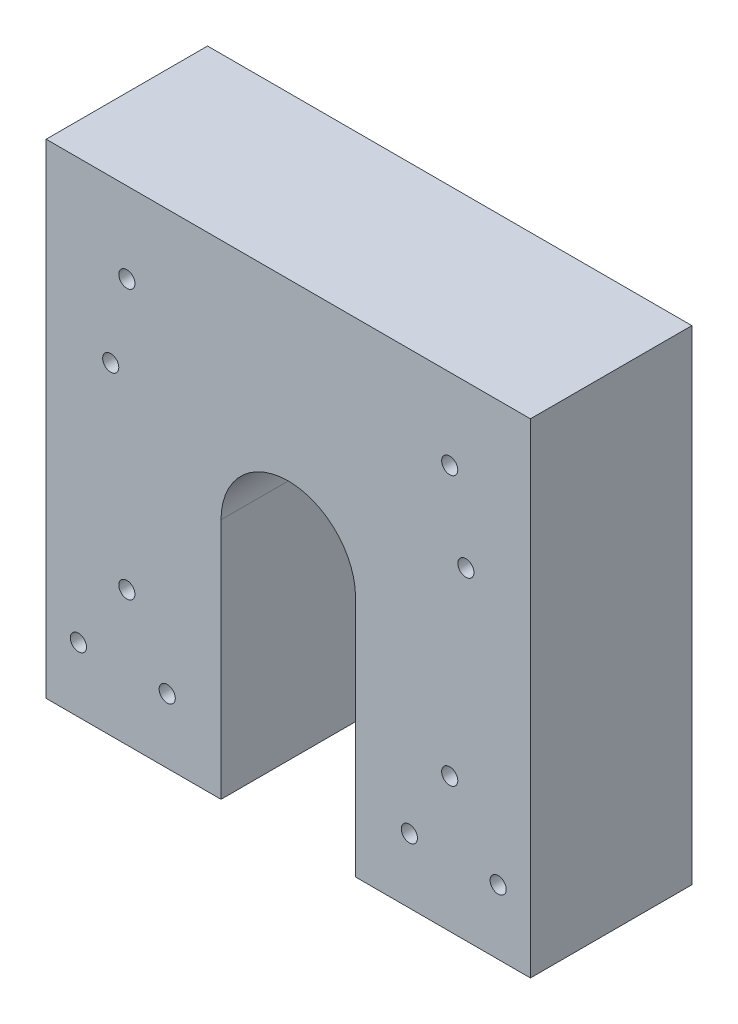
ISO-10303-21;
HEADER;
FILE_DESCRIPTION(('STEP AP214'),'2;1');
FILE_NAME('part.step','',(''),(''),'','','');
FILE_SCHEMA(('AUTOMOTIVE_DESIGN { 1 0 10303 214 1 1 1 1 }'));
ENDSEC;
DATA;
#1=APPLICATION_CONTEXT('core data for automotive mechanical design processes');
#2=APPLICATION_PROTOCOL_DEFINITION('international standard','automotive_design',2000,#1);
#3=PRODUCT_CONTEXT('',#1,'mechanical');
#4=PRODUCT('Part','Part','',(#3));
#5=PRODUCT_RELATED_PRODUCT_CATEGORY('part','',(#4));
#6=PRODUCT_DEFINITION_FORMATION('','',#4);
#7=PRODUCT_DEFINITION_CONTEXT('part definition',#1,'design');
#8=PRODUCT_DEFINITION('design','',#6,#7);
#9=PRODUCT_DEFINITION_SHAPE('','',#8);
#10=(LENGTH_UNIT() NAMED_UNIT(*) SI_UNIT(.MILLI.,.METRE.));
#11=(NAMED_UNIT(*) PLANE_ANGLE_UNIT() SI_UNIT($,.RADIAN.));
#12=(NAMED_UNIT(*) SI_UNIT($,.STERADIAN.) SOLID_ANGLE_UNIT());
#13=UNCERTAINTY_MEASURE_WITH_UNIT(LENGTH_MEASURE(1.E-05),#10,'distance_accuracy_value','');
#14=(GEOMETRIC_REPRESENTATION_CONTEXT(3) GLOBAL_UNCERTAINTY_ASSIGNED_CONTEXT((#13)) GLOBAL_UNIT_ASSIGNED_CONTEXT((#10,
#11,#12)) REPRESENTATION_CONTEXT('',''));
#15=CARTESIAN_POINT('',(0.,0.,0.));
#16=DIRECTION('',(0.,0.,1.));
#17=DIRECTION('',(1.,0.,0.));
#18=AXIS2_PLACEMENT_3D('',#15,#16,#17);
#19=CARTESIAN_POINT('',(0.,0.,30.));
#20=DIRECTION('',(0.,0.,-1.));
#21=DIRECTION('',(-1.,0.,0.));
#22=AXIS2_PLACEMENT_3D('',#19,#20,#21);
#23=PLANE('',#22);
#24=CARTESIAN_POINT('',(-30.,-20.,30.));
#25=DIRECTION('',(0.,0.,1.));
#26=DIRECTION('',(1.,0.,0.));
#27=AXIS2_PLACEMENT_3D('',#24,#25,#26);
#28=CIRCLE('',#27,1.5);
#29=CARTESIAN_POINT('',(-28.5,-20.,30.));
#30=VERTEX_POINT('',#29);
#31=EDGE_CURVE('E252',#30,#30,#28,.T.);
#32=ORIENTED_EDGE('',*,*,#31,.F.);
#33=EDGE_LOOP('',(#32));
#34=FACE_BOUND('',#33,.T.);
#35=CARTESIAN_POINT('',(30.,-20.,30.));
#36=DIRECTION('',(0.,0.,1.));
#37=DIRECTION('',(1.,0.,0.));
#38=AXIS2_PLACEMENT_3D('',#35,#36,#37);
#39=CIRCLE('',#38,1.5);
#40=CARTESIAN_POINT('',(31.5,-20.,30.));
#41=VERTEX_POINT('',#40);
#42=EDGE_CURVE('E410',#41,#41,#39,.T.);
#43=ORIENTED_EDGE('',*,*,#42,.F.);
#44=EDGE_LOOP('',(#43));
#45=FACE_BOUND('',#44,.T.);
#46=CARTESIAN_POINT('',(-33.,15.,30.));
#47=DIRECTION('',(0.,0.,1.));
#48=DIRECTION('',(1.,0.,0.));
#49=AXIS2_PLACEMENT_3D('',#46,#47,#48);
#50=CIRCLE('',#49,1.5);
#51=CARTESIAN_POINT('',(-31.5,15.,30.));
#52=VERTEX_POINT('',#51);
#53=EDGE_CURVE('E395',#52,#52,#50,.T.);
#54=ORIENTED_EDGE('',*,*,#53,.F.);
#55=EDGE_LOOP('',(#54));
#56=FACE_BOUND('',#55,.T.);
#57=CARTESIAN_POINT('',(-22.5,-33.,30.));
#58=DIRECTION('',(0.,0.,1.));
#59=DIRECTION('',(1.,0.,0.));
#60=AXIS2_PLACEMENT_3D('',#57,#58,#59);
#61=CIRCLE('',#60,1.5);
#62=CARTESIAN_POINT('',(-21.,-33.,30.));
#63=VERTEX_POINT('',#62);
#64=EDGE_CURVE('E376',#63,#63,#61,.T.);
#65=ORIENTED_EDGE('',*,*,#64,.F.);
#66=EDGE_LOOP('',(#65));
#67=FACE_BOUND('',#66,.T.);
#68=CARTESIAN_POINT('',(-39.,-33.,30.));
#69=DIRECTION('',(0.,0.,1.));
#70=DIRECTION('',(1.,0.,0.));
#71=AXIS2_PLACEMENT_3D('',#68,#69,#70);
#72=CIRCLE('',#71,1.5);
#73=CARTESIAN_POINT('',(-37.5,-33.,30.));
#74=VERTEX_POINT('',#73);
#75=EDGE_CURVE('E373',#74,#74,#72,.T.);
#76=ORIENTED_EDGE('',*,*,#75,.F.);
#77=EDGE_LOOP('',(#76));
#78=FACE_BOUND('',#77,.T.);
#79=CARTESIAN_POINT('',(-30.,30.,30.));
#80=DIRECTION('',(0.,0.,1.));
#81=DIRECTION('',(1.,0.,0.));
#82=AXIS2_PLACEMENT_3D('',#79,#80,#81);
#83=CIRCLE('',#82,1.5);
#84=CARTESIAN_POINT('',(-28.5,30.,30.));
#85=VERTEX_POINT('',#84);
#86=EDGE_CURVE('E218',#85,#85,#83,.T.);
#87=ORIENTED_EDGE('',*,*,#86,.F.);
#88=EDGE_LOOP('',(#87));
#89=FACE_BOUND('',#88,.T.);
#90=DIRECTION('',(0.,-1.,0.));
#91=VECTOR('',#90,1.);
#92=CARTESIAN_POINT('',(12.5,0.,30.));
#93=LINE('',#92,#91);
#94=CARTESIAN_POINT('',(12.5,0.,30.));
#95=VERTEX_POINT('',#94);
#96=CARTESIAN_POINT('',(12.5,-45.,30.));
#97=VERTEX_POINT('',#96);
#98=EDGE_CURVE('E132',#95,#97,#93,.T.);
#99=ORIENTED_EDGE('',*,*,#98,.T.);
#100=DIRECTION('',(1.,0.,0.));
#101=VECTOR('',#100,1.);
#102=CARTESIAN_POINT('',(-45.,-45.,30.));
#103=LINE('',#102,#101);
#104=CARTESIAN_POINT('',(45.,-45.,30.));
#105=VERTEX_POINT('',#104);
#106=EDGE_CURVE('E70',#97,#105,#103,.T.);
#107=ORIENTED_EDGE('',*,*,#106,.T.);
#108=DIRECTION('',(0.,1.,0.));
#109=VECTOR('',#108,1.);
#110=CARTESIAN_POINT('',(45.,-45.,30.));
#111=LINE('',#110,#109);
#112=CARTESIAN_POINT('',(45.,45.,30.));
#113=VERTEX_POINT('',#112);
#114=EDGE_CURVE('E171',#105,#113,#111,.T.);
#115=ORIENTED_EDGE('',*,*,#114,.T.);
#116=DIRECTION('',(-1.,0.,0.));
#117=VECTOR('',#116,1.);
#118=CARTESIAN_POINT('',(-45.,45.,30.));
#119=LINE('',#118,#117);
#120=CARTESIAN_POINT('',(-45.,45.,30.));
#121=VERTEX_POINT('',#120);
#122=EDGE_CURVE('E100',#113,#121,#119,.T.);
#123=ORIENTED_EDGE('',*,*,#122,.T.);
#124=DIRECTION('',(0.,-1.,0.));
#125=VECTOR('',#124,1.);
#126=CARTESIAN_POINT('',(-45.,-45.,30.));
#127=LINE('',#126,#125);
#128=CARTESIAN_POINT('',(-45.,-45.,30.));
#129=VERTEX_POINT('',#128);
#130=EDGE_CURVE('E177',#121,#129,#127,.T.);
#131=ORIENTED_EDGE('',*,*,#130,.T.);
#132=CARTESIAN_POINT('',(-12.5,-45.,30.));
#133=VERTEX_POINT('',#132);
#134=EDGE_CURVE('E180',#129,#133,#103,.T.);
#135=ORIENTED_EDGE('',*,*,#134,.T.);
#136=DIRECTION('',(0.,-1.,0.));
#137=VECTOR('',#136,1.);
#138=CARTESIAN_POINT('',(-12.5,0.,30.));
#139=LINE('',#138,#137);
#140=CARTESIAN_POINT('',(-12.5,0.,30.));
#141=VERTEX_POINT('',#140);
#142=EDGE_CURVE('E130',#141,#133,#139,.T.);
#143=ORIENTED_EDGE('',*,*,#142,.F.);
#144=CARTESIAN_POINT('',(0.,0.,30.));
#145=DIRECTION('',(0.,0.,1.));
#146=DIRECTION('',(1.,0.,0.));
#147=AXIS2_PLACEMENT_3D('',#144,#145,#146);
#148=CIRCLE('',#147,12.5);
#149=EDGE_CURVE('E124',#95,#141,#148,.T.);
#150=ORIENTED_EDGE('',*,*,#149,.F.);
#151=EDGE_LOOP('',(#99,#107,#115,#123,#131,#135,#143,#150));
#152=FACE_BOUND('',#151,.T.);
#153=CARTESIAN_POINT('',(22.5,-33.,30.));
#154=DIRECTION('',(0.,0.,1.));
#155=DIRECTION('',(1.,0.,0.));
#156=AXIS2_PLACEMENT_3D('',#153,#154,#155);
#157=CIRCLE('',#156,1.5);
#158=CARTESIAN_POINT('',(24.,-33.,30.));
#159=VERTEX_POINT('',#158);
#160=EDGE_CURVE('E382',#159,#159,#157,.F.);
#161=ORIENTED_EDGE('',*,*,#160,.T.);
#162=EDGE_LOOP('',(#161));
#163=FACE_BOUND('',#162,.T.);
#164=CARTESIAN_POINT('',(30.,30.,30.));
#165=DIRECTION('',(0.,0.,1.));
#166=DIRECTION('',(1.,0.,0.));
#167=AXIS2_PLACEMENT_3D('',#164,#165,#166);
#168=CIRCLE('',#167,1.5);
#169=CARTESIAN_POINT('',(31.5,30.,30.));
#170=VERTEX_POINT('',#169);
#171=EDGE_CURVE('E390',#170,#170,#168,.F.);
#172=ORIENTED_EDGE('',*,*,#171,.T.);
#173=EDGE_LOOP('',(#172));
#174=FACE_BOUND('',#173,.T.);
#175=CARTESIAN_POINT('',(33.,15.,30.));
#176=DIRECTION('',(0.,0.,1.));
#177=DIRECTION('',(1.,0.,0.));
#178=AXIS2_PLACEMENT_3D('',#175,#176,#177);
#179=CIRCLE('',#178,1.5);
#180=CARTESIAN_POINT('',(34.5,15.,30.));
#181=VERTEX_POINT('',#180);
#182=EDGE_CURVE('E386',#181,#181,#179,.F.);
#183=ORIENTED_EDGE('',*,*,#182,.T.);
#184=EDGE_LOOP('',(#183));
#185=FACE_BOUND('',#184,.T.);
#186=CARTESIAN_POINT('',(39.,-33.,30.));
#187=DIRECTION('',(0.,0.,1.));
#188=DIRECTION('',(1.,0.,0.));
#189=AXIS2_PLACEMENT_3D('',#186,#187,#188);
#190=CIRCLE('',#189,1.5);
#191=CARTESIAN_POINT('',(40.5,-33.,30.));
#192=VERTEX_POINT('',#191);
#193=EDGE_CURVE('E391',#192,#192,#190,.F.);
#194=ORIENTED_EDGE('',*,*,#193,.T.);
#195=EDGE_LOOP('',(#194));
#196=FACE_BOUND('',#195,.T.);
#197=ADVANCED_FACE('F38',(#34,#45,#56,#67,#78,#89,#152,#163,#174,#185,#196),#23,.F.);
#198=CARTESIAN_POINT('',(0.,0.,0.));
#199=DIRECTION('',(0.,0.,-1.));
#200=DIRECTION('',(-1.,0.,0.));
#201=AXIS2_PLACEMENT_3D('',#198,#199,#200);
#202=PLANE('',#201);
#203=CARTESIAN_POINT('',(33.,15.,0.));
#204=DIRECTION('',(0.,0.,-1.));
#205=DIRECTION('',(-1.,0.,0.));
#206=AXIS2_PLACEMENT_3D('',#203,#204,#205);
#207=CIRCLE('',#206,1.5);
#208=CARTESIAN_POINT('',(31.5,15.,0.));
#209=VERTEX_POINT('',#208);
#210=EDGE_CURVE('E238',#209,#209,#207,.F.);
#211=ORIENTED_EDGE('',*,*,#210,.T.);
#212=EDGE_LOOP('',(#211));
#213=FACE_BOUND('',#212,.T.);
#214=CARTESIAN_POINT('',(22.5,-33.,0.));
#215=DIRECTION('',(0.,0.,-1.));
#216=DIRECTION('',(-1.,0.,0.));
#217=AXIS2_PLACEMENT_3D('',#214,#215,#216);
#218=CIRCLE('',#217,1.5);
#219=CARTESIAN_POINT('',(21.,-33.,0.));
#220=VERTEX_POINT('',#219);
#221=EDGE_CURVE('E226',#220,#220,#218,.F.);
#222=ORIENTED_EDGE('',*,*,#221,.T.);
#223=EDGE_LOOP('',(#222));
#224=FACE_BOUND('',#223,.T.);
#225=CARTESIAN_POINT('',(-22.5,-33.,0.));
#226=DIRECTION('',(0.,0.,-1.));
#227=DIRECTION('',(-1.,0.,0.));
#228=AXIS2_PLACEMENT_3D('',#225,#226,#227);
#229=CIRCLE('',#228,1.5);
#230=CARTESIAN_POINT('',(-24.,-33.,0.));
#231=VERTEX_POINT('',#230);
#232=EDGE_CURVE('E222',#231,#231,#229,.T.);
#233=ORIENTED_EDGE('',*,*,#232,.F.);
#234=EDGE_LOOP('',(#233));
#235=FACE_BOUND('',#234,.T.);
#236=CARTESIAN_POINT('',(-39.,-33.,0.));
#237=DIRECTION('',(0.,0.,-1.));
#238=DIRECTION('',(-1.,0.,0.));
#239=AXIS2_PLACEMENT_3D('',#236,#237,#238);
#240=CIRCLE('',#239,1.5);
#241=CARTESIAN_POINT('',(-40.5,-33.,0.));
#242=VERTEX_POINT('',#241);
#243=EDGE_CURVE('E217',#242,#242,#240,.T.);
#244=ORIENTED_EDGE('',*,*,#243,.F.);
#245=EDGE_LOOP('',(#244));
#246=FACE_BOUND('',#245,.T.);
#247=CARTESIAN_POINT('',(-30.,30.,0.));
#248=DIRECTION('',(0.,0.,-1.));
#249=DIRECTION('',(-1.,0.,0.));
#250=AXIS2_PLACEMENT_3D('',#247,#248,#249);
#251=CIRCLE('',#250,1.5);
#252=CARTESIAN_POINT('',(-31.5,30.,0.));
#253=VERTEX_POINT('',#252);
#254=EDGE_CURVE('E213',#253,#253,#251,.T.);
#255=ORIENTED_EDGE('',*,*,#254,.F.);
#256=EDGE_LOOP('',(#255));
#257=FACE_BOUND('',#256,.T.);
#258=DIRECTION('',(1.,0.,0.));
#259=VECTOR('',#258,1.);
#260=CARTESIAN_POINT('',(-45.,-45.,0.));
#261=LINE('',#260,#259);
#262=CARTESIAN_POINT('',(12.5,-45.,0.));
#263=VERTEX_POINT('',#262);
#264=CARTESIAN_POINT('',(45.,-45.,0.));
#265=VERTEX_POINT('',#264);
#266=EDGE_CURVE('E92',#263,#265,#261,.T.);
#267=ORIENTED_EDGE('',*,*,#266,.F.);
#268=DIRECTION('',(0.,1.,0.));
#269=VECTOR('',#268,1.);
#270=CARTESIAN_POINT('',(12.5,0.,0.));
#271=LINE('',#270,#269);
#272=CARTESIAN_POINT('',(12.5,0.,0.));
#273=VERTEX_POINT('',#272);
#274=EDGE_CURVE('E11',#263,#273,#271,.T.);
#275=ORIENTED_EDGE('',*,*,#274,.T.);
#276=CARTESIAN_POINT('',(0.,0.,0.));
#277=DIRECTION('',(0.,0.,-1.));
#278=DIRECTION('',(-1.,0.,0.));
#279=AXIS2_PLACEMENT_3D('',#276,#277,#278);
#280=CIRCLE('',#279,12.5);
#281=CARTESIAN_POINT('',(-12.5,0.,0.));
#282=VERTEX_POINT('',#281);
#283=EDGE_CURVE('E127',#282,#273,#280,.T.);
#284=ORIENTED_EDGE('',*,*,#283,.F.);
#285=DIRECTION('',(0.,1.,0.));
#286=VECTOR('',#285,1.);
#287=CARTESIAN_POINT('',(-12.5,0.,0.));
#288=LINE('',#287,#286);
#289=CARTESIAN_POINT('',(-12.5,-45.,0.));
#290=VERTEX_POINT('',#289);
#291=EDGE_CURVE('E53',#290,#282,#288,.T.);
#292=ORIENTED_EDGE('',*,*,#291,.F.);
#293=CARTESIAN_POINT('',(-45.,-45.,0.));
#294=VERTEX_POINT('',#293);
#295=EDGE_CURVE('E174',#294,#290,#261,.T.);
#296=ORIENTED_EDGE('',*,*,#295,.F.);
#297=DIRECTION('',(0.,-1.,0.));
#298=VECTOR('',#297,1.);
#299=CARTESIAN_POINT('',(-45.,-45.,0.));
#300=LINE('',#299,#298);
#301=CARTESIAN_POINT('',(-45.,45.,0.));
#302=VERTEX_POINT('',#301);
#303=EDGE_CURVE('E190',#302,#294,#300,.T.);
#304=ORIENTED_EDGE('',*,*,#303,.F.);
#305=DIRECTION('',(-1.,0.,0.));
#306=VECTOR('',#305,1.);
#307=CARTESIAN_POINT('',(-45.,45.,0.));
#308=LINE('',#307,#306);
#309=CARTESIAN_POINT('',(45.,45.,0.));
#310=VERTEX_POINT('',#309);
#311=EDGE_CURVE('E187',#310,#302,#308,.T.);
#312=ORIENTED_EDGE('',*,*,#311,.F.);
#313=DIRECTION('',(0.,1.,0.));
#314=VECTOR('',#313,1.);
#315=CARTESIAN_POINT('',(45.,-45.,0.));
#316=LINE('',#315,#314);
#317=EDGE_CURVE('E159',#265,#310,#316,.T.);
#318=ORIENTED_EDGE('',*,*,#317,.F.);
#319=EDGE_LOOP('',(#267,#275,#284,#292,#296,#304,#312,#318));
#320=FACE_BOUND('',#319,.T.);
#321=CARTESIAN_POINT('',(-33.,15.,0.));
#322=DIRECTION('',(0.,0.,-1.));
#323=DIRECTION('',(-1.,0.,0.));
#324=AXIS2_PLACEMENT_3D('',#321,#322,#323);
#325=CIRCLE('',#324,1.5);
#326=CARTESIAN_POINT('',(-34.5,15.,0.));
#327=VERTEX_POINT('',#326);
#328=EDGE_CURVE('E230',#327,#327,#325,.T.);
#329=ORIENTED_EDGE('',*,*,#328,.F.);
#330=EDGE_LOOP('',(#329));
#331=FACE_BOUND('',#330,.T.);
#332=CARTESIAN_POINT('',(30.,30.,0.));
#333=DIRECTION('',(0.,0.,-1.));
#334=DIRECTION('',(-1.,0.,0.));
#335=AXIS2_PLACEMENT_3D('',#332,#333,#334);
#336=CIRCLE('',#335,1.5);
#337=CARTESIAN_POINT('',(28.5,30.,0.));
#338=VERTEX_POINT('',#337);
#339=EDGE_CURVE('E234',#338,#338,#336,.F.);
#340=ORIENTED_EDGE('',*,*,#339,.T.);
#341=EDGE_LOOP('',(#340));
#342=FACE_BOUND('',#341,.T.);
#343=CARTESIAN_POINT('',(39.,-33.,0.));
#344=DIRECTION('',(0.,0.,-1.));
#345=DIRECTION('',(-1.,0.,0.));
#346=AXIS2_PLACEMENT_3D('',#343,#344,#345);
#347=CIRCLE('',#346,1.5);
#348=CARTESIAN_POINT('',(37.5,-33.,0.));
#349=VERTEX_POINT('',#348);
#350=EDGE_CURVE('E136',#349,#349,#347,.F.);
#351=ORIENTED_EDGE('',*,*,#350,.T.);
#352=EDGE_LOOP('',(#351));
#353=FACE_BOUND('',#352,.T.);
#354=ADVANCED_FACE('F314',(#213,#224,#235,#246,#257,#320,#331,#342,#353),#202,.T.);
#355=CARTESIAN_POINT('',(-45.,-45.,30.));
#356=DIRECTION('',(0.,1.,0.));
#357=DIRECTION('',(0.,0.,1.));
#358=AXIS2_PLACEMENT_3D('',#355,#356,#357);
#359=PLANE('',#358);
#360=CARTESIAN_POINT('',(30.,-45.,15.));
#361=DIRECTION('',(0.,-1.,0.));
#362=DIRECTION('',(0.,0.,-1.));
#363=AXIS2_PLACEMENT_3D('',#360,#361,#362);
#364=CIRCLE('',#363,4.);
#365=CARTESIAN_POINT('',(30.,-45.,11.));
#366=VERTEX_POINT('',#365);
#367=EDGE_CURVE('E148',#366,#366,#364,.T.);
#368=ORIENTED_EDGE('',*,*,#367,.F.);
#369=EDGE_LOOP('',(#368));
#370=FACE_BOUND('',#369,.T.);
#371=DIRECTION('',(0.,0.,1.));
#372=VECTOR('',#371,1.);
#373=CARTESIAN_POINT('',(12.5,-45.,-5.00000000000002));
#374=LINE('',#373,#372);
#375=EDGE_CURVE('E134',#263,#97,#374,.T.);
#376=ORIENTED_EDGE('',*,*,#375,.F.);
#377=ORIENTED_EDGE('',*,*,#266,.T.);
#378=DIRECTION('',(0.,0.,-1.));
#379=VECTOR('',#378,1.);
#380=CARTESIAN_POINT('',(45.,-45.,30.));
#381=LINE('',#380,#379);
#382=EDGE_CURVE('E183',#105,#265,#381,.T.);
#383=ORIENTED_EDGE('',*,*,#382,.F.);
#384=ORIENTED_EDGE('',*,*,#106,.F.);
#385=EDGE_LOOP('',(#376,#377,#383,#384));
#386=FACE_BOUND('',#385,.T.);
#387=ADVANCED_FACE('F320',(#370,#386),#359,.F.);
#388=CARTESIAN_POINT('',(45.,-45.,30.));
#389=DIRECTION('',(-1.,0.,0.));
#390=DIRECTION('',(0.,0.,1.));
#391=AXIS2_PLACEMENT_3D('',#388,#389,#390);
#392=PLANE('',#391);
#393=ORIENTED_EDGE('',*,*,#317,.T.);
#394=DIRECTION('',(0.,0.,-1.));
#395=VECTOR('',#394,1.);
#396=CARTESIAN_POINT('',(45.,45.,30.));
#397=LINE('',#396,#395);
#398=EDGE_CURVE('E206',#113,#310,#397,.T.);
#399=ORIENTED_EDGE('',*,*,#398,.F.);
#400=ORIENTED_EDGE('',*,*,#114,.F.);
#401=ORIENTED_EDGE('',*,*,#382,.T.);
#402=EDGE_LOOP('',(#393,#399,#400,#401));
#403=FACE_BOUND('',#402,.T.);
#404=ADVANCED_FACE('F40',(#403),#392,.F.);
#405=CARTESIAN_POINT('',(-45.,45.,30.));
#406=DIRECTION('',(0.,-1.,0.));
#407=DIRECTION('',(0.,0.,-1.));
#408=AXIS2_PLACEMENT_3D('',#405,#406,#407);
#409=PLANE('',#408);
#410=ORIENTED_EDGE('',*,*,#311,.T.);
#411=DIRECTION('',(0.,0.,-1.));
#412=VECTOR('',#411,1.);
#413=CARTESIAN_POINT('',(-45.,45.,30.));
#414=LINE('',#413,#412);
#415=EDGE_CURVE('E202',#121,#302,#414,.T.);
#416=ORIENTED_EDGE('',*,*,#415,.F.);
#417=ORIENTED_EDGE('',*,*,#122,.F.);
#418=ORIENTED_EDGE('',*,*,#398,.T.);
#419=EDGE_LOOP('',(#410,#416,#417,#418));
#420=FACE_BOUND('',#419,.T.);
#421=ADVANCED_FACE('F334',(#420),#409,.F.);
#422=CARTESIAN_POINT('',(-45.,-45.,30.));
#423=DIRECTION('',(1.,0.,0.));
#424=DIRECTION('',(0.,0.,-1.));
#425=AXIS2_PLACEMENT_3D('',#422,#423,#424);
#426=PLANE('',#425);
#427=ORIENTED_EDGE('',*,*,#303,.T.);
#428=DIRECTION('',(0.,0.,-1.));
#429=VECTOR('',#428,1.);
#430=CARTESIAN_POINT('',(-45.,-45.,30.));
#431=LINE('',#430,#429);
#432=EDGE_CURVE('E198',#129,#294,#431,.T.);
#433=ORIENTED_EDGE('',*,*,#432,.F.);
#434=ORIENTED_EDGE('',*,*,#130,.F.);
#435=ORIENTED_EDGE('',*,*,#415,.T.);
#436=EDGE_LOOP('',(#427,#433,#434,#435));
#437=FACE_BOUND('',#436,.T.);
#438=ADVANCED_FACE('F331',(#437),#426,.F.);
#439=CARTESIAN_POINT('',(-30.,-45.,15.));
#440=DIRECTION('',(0.,-1.,0.));
#441=DIRECTION('',(0.,0.,-1.));
#442=AXIS2_PLACEMENT_3D('',#439,#440,#441);
#443=CIRCLE('',#442,4.);
#444=CARTESIAN_POINT('',(-30.,-45.,11.));
#445=VERTEX_POINT('',#444);
#446=EDGE_CURVE('E160',#445,#445,#443,.T.);
#447=ORIENTED_EDGE('',*,*,#446,.F.);
#448=EDGE_LOOP('',(#447));
#449=FACE_BOUND('',#448,.T.);
#450=ORIENTED_EDGE('',*,*,#295,.T.);
#451=DIRECTION('',(0.,0.,1.));
#452=VECTOR('',#451,1.);
#453=CARTESIAN_POINT('',(-12.5,-45.,-5.00000000000002));
#454=LINE('',#453,#452);
#455=EDGE_CURVE('E149',#290,#133,#454,.T.);
#456=ORIENTED_EDGE('',*,*,#455,.T.);
#457=ORIENTED_EDGE('',*,*,#134,.F.);
#458=ORIENTED_EDGE('',*,*,#432,.T.);
#459=EDGE_LOOP('',(#450,#456,#457,#458));
#460=FACE_BOUND('',#459,.T.);
#461=ADVANCED_FACE('F328',(#449,#460),#359,.F.);
#462=CARTESIAN_POINT('',(30.,-5.,15.));
#463=DIRECTION('',(0.,-1.,0.));
#464=DIRECTION('',(0.,0.,-1.));
#465=AXIS2_PLACEMENT_3D('',#462,#463,#464);
#466=CYLINDRICAL_SURFACE('',#465,4.);
#467=CARTESIAN_POINT('',(31.5,-20.,18.7080992435478));
#468=CARTESIAN_POINT('',(31.5000030410611,-19.9189925162792,18.7080964063381));
#469=CARTESIAN_POINT('',(31.4934159754949,-19.8380050774964,18.7107826024099));
#470=CARTESIAN_POINT('',(31.4673618789547,-19.6784719170868,18.7211615930497));
#471=CARTESIAN_POINT('',(31.4478952337326,-19.599926122405,18.7288542376711));
#472=CARTESIAN_POINT('',(31.3968965761057,-19.4476246283865,18.748254802809));
#473=CARTESIAN_POINT('',(31.3653934726635,-19.3738579433489,18.7599530956926));
#474=CARTESIAN_POINT('',(31.291318567427,-19.2326281031812,18.786031342066));
#475=CARTESIAN_POINT('',(31.2487434409504,-19.1651668497175,18.8004121006732));
#476=CARTESIAN_POINT('',(31.1514666137416,-19.0351096883772,18.8310357466571));
#477=CARTESIAN_POINT('',(31.0963038121331,-18.9728714703706,18.847333419236));
#478=CARTESIAN_POINT('',(30.9763958397789,-18.8582771853285,18.8794975062855));
#479=CARTESIAN_POINT('',(30.9116486302567,-18.8059232262581,18.8953638281478));
#480=CARTESIAN_POINT('',(30.7716946551776,-18.7108604877044,18.9255287393655));
#481=CARTESIAN_POINT('',(30.696206947538,-18.6685405252841,18.9397556122351));
#482=CARTESIAN_POINT('',(30.5385557719653,-18.5973488274751,18.9643800797385));
#483=CARTESIAN_POINT('',(30.4563946309335,-18.568472428008,18.9747790021701));
#484=CARTESIAN_POINT('',(30.2914893416768,-18.5262421042254,18.9901869710344));
#485=CARTESIAN_POINT('',(30.2089231972816,-18.5122723725595,18.9954091521477));
#486=CARTESIAN_POINT('',(30.0424643637948,-18.498278799055,19.0006401410794));
#487=CARTESIAN_POINT('',(29.9585721149372,-18.4982504223813,19.000650644149));
#488=CARTESIAN_POINT('',(29.7962564569355,-18.5117817614652,18.9955926590389));
#489=CARTESIAN_POINT('',(29.7177678217331,-18.5246692979488,18.9907754199668));
#490=CARTESIAN_POINT('',(29.5641607820156,-18.5625359152255,18.9769327493226));
#491=CARTESIAN_POINT('',(29.4890426165697,-18.587515852262,18.9679070197558));
#492=CARTESIAN_POINT('',(29.3430109826969,-18.6491704516758,18.9463776916753));
#493=CARTESIAN_POINT('',(29.2721746077127,-18.6860100052684,18.9338253947008));
#494=CARTESIAN_POINT('',(29.1375133920424,-18.7701920969294,18.9065131022528));
#495=CARTESIAN_POINT('',(29.0736908230677,-18.8175380230176,18.8917523951284));
#496=CARTESIAN_POINT('',(28.9509095131991,-18.9246272862832,18.8605252965582));
#497=CARTESIAN_POINT('',(28.8924538547365,-18.9849339156504,18.8440096376388));
#498=CARTESIAN_POINT('',(28.7862960443066,-19.1145929933216,18.8118246064572));
#499=CARTESIAN_POINT('',(28.738596593071,-19.1839477065866,18.7961554474885));
#500=CARTESIAN_POINT('',(28.6543438819185,-19.3317194674628,18.7671270350034));
#501=CARTESIAN_POINT('',(28.6180615214817,-19.4103034936861,18.7538267715028));
#502=CARTESIAN_POINT('',(28.559435355585,-19.5730962251676,18.73172438629));
#503=CARTESIAN_POINT('',(28.5370837939441,-19.6573017715937,18.7229197620578));
#504=CARTESIAN_POINT('',(28.5080980829033,-19.8239759623159,18.7113959722285));
#505=CARTESIAN_POINT('',(28.5006647884103,-19.9062841055361,18.7083678524154));
#506=CARTESIAN_POINT('',(28.4994211436373,-20.0710093567417,18.7078653952502));
#507=CARTESIAN_POINT('',(28.5056073890624,-20.1534264323525,18.7103896700399));
#508=CARTESIAN_POINT('',(28.5307026647984,-20.3119299222877,18.7203938162973));
#509=CARTESIAN_POINT('',(28.5489938166578,-20.3881311357647,18.7276327621645));
#510=CARTESIAN_POINT('',(28.5970022535936,-20.5363479447202,18.7459648704636));
#511=CARTESIAN_POINT('',(28.6267218796538,-20.6083626791681,18.7570588225017));
#512=CARTESIAN_POINT('',(28.6979970772472,-20.7491644380762,18.7823624311608));
#513=CARTESIAN_POINT('',(28.7399545482295,-20.8177292921373,18.7966732889206));
#514=CARTESIAN_POINT('',(28.8340868213752,-20.947128981726,18.8266281429429));
#515=CARTESIAN_POINT('',(28.8862653630357,-21.0079609746246,18.8422726259408));
#516=CARTESIAN_POINT('',(29.0032726590991,-21.1241683731951,18.8743304655318));
#517=CARTESIAN_POINT('',(29.0686936585089,-21.1789534087687,18.8907296935703));
#518=CARTESIAN_POINT('',(29.2082025282468,-21.2768383675894,18.921498749633));
#519=CARTESIAN_POINT('',(29.2822904266773,-21.3199382529458,18.9358685710766));
#520=CARTESIAN_POINT('',(29.4369836705315,-21.3929460561996,18.9609498570455));
#521=CARTESIAN_POINT('',(29.5175655669354,-21.4228991237926,18.9716738133801));
#522=CARTESIAN_POINT('',(29.6831181124768,-21.4686564138499,18.9882943671257));
#523=CARTESIAN_POINT('',(29.7680866792764,-21.4844672854224,18.9941932329941));
#524=CARTESIAN_POINT('',(29.9346644147262,-21.5007744027548,19.0002840731707));
#525=CARTESIAN_POINT('',(30.0161807680608,-21.502109483059,19.0007886095376));
#526=CARTESIAN_POINT('',(30.1782267864124,-21.4915848405546,18.9968488980922));
#527=CARTESIAN_POINT('',(30.2587565692453,-21.4797267091141,18.9924052471313));
#528=CARTESIAN_POINT('',(30.4145482483771,-21.4437411485064,18.9792108960377));
#529=CARTESIAN_POINT('',(30.4898907310688,-21.4199200941216,18.9705679137802));
#530=CARTESIAN_POINT('',(30.6355154730064,-21.3609899866156,18.9498778362099));
#531=CARTESIAN_POINT('',(30.7057967712756,-21.3258787966952,18.9378300965566));
#532=CARTESIAN_POINT('',(30.8425401769944,-21.2436860564952,18.9109061830007));
#533=CARTESIAN_POINT('',(30.9087175488469,-21.1961633594859,18.8959324010883));
#534=CARTESIAN_POINT('',(31.0324173475234,-21.0911921698124,18.8649950769484));
#535=CARTESIAN_POINT('',(31.0899366712559,-21.0337401341921,18.8490311827403));
#536=CARTESIAN_POINT('',(31.197812142362,-20.9069358683549,18.8168812973917));
#537=CARTESIAN_POINT('',(31.2476299981603,-20.8371155978457,18.8007280534916));
#538=CARTESIAN_POINT('',(31.3348470955684,-20.6895841304267,18.7709832500364));
#539=CARTESIAN_POINT('',(31.3722450487816,-20.6118721159465,18.7573919563122));
#540=CARTESIAN_POINT('',(31.4346588697426,-20.4470443190246,18.7340226985327));
#541=CARTESIAN_POINT('',(31.4590600289952,-20.3596656334882,18.7244380329086));
#542=CARTESIAN_POINT('',(31.4917235672208,-20.1815147280442,18.7114799433631));
#543=CARTESIAN_POINT('',(31.4999965933957,-20.09074478729,18.7081024217974));
#544=CARTESIAN_POINT('',(31.5,-20.,18.7080992435478));
#545=B_SPLINE_CURVE_WITH_KNOTS('',3,(#467,#468,#469,#470,#471,#472,#473,#474,#475,#476,#477,
#478,#479,#480,#481,#482,#483,#484,#485,#486,#487,#488,#489,#490,#491,#492,#493,#494,#495,#496,
#497,#498,#499,#500,#501,#502,#503,#504,#505,#506,#507,#508,#509,#510,#511,#512,#513,#514,#515,
#516,#517,#518,#519,#520,#521,#522,#523,#524,#525,#526,#527,#528,#529,#530,#531,#532,#533,#534,
#535,#536,#537,#538,#539,#540,#541,#542,#543,#544),.UNSPECIFIED.,.T.,.F.,(4,2,2,2,2,2,2,2,2,2,2,
2,2,2,2,2,2,2,2,2,2,2,2,2,2,2,2,2,2,2,2,2,2,2,2,2,2,2,4),(0.,0.242684541416174,
0.485361814598854,0.727459856757029,0.969630679682935,1.22274652401128,1.47591628822983,
1.73770072136421,1.99939426381331,2.24980018489679,2.50012465404858,2.73806472803195,
2.97602165263336,3.21744131210669,3.45893893628977,3.71456675065875,3.97025867827335,
4.23162592252967,4.49284751635475,4.73965657740487,4.98640395388886,5.22143845928199,
5.45652113429527,5.70041561005823,5.94439948466357,6.20385016993625,6.46330169650179,
6.7218550889017,6.98028685560128,7.22365720549937,7.46699820319481,7.70440274003893,
7.94185223512833,8.18928323676989,8.43680270894967,8.69738599542081,8.95799630544244,
9.23003178870929,9.50188762323056),.UNSPECIFIED.);
#546=CARTESIAN_POINT('',(31.5,-20.,18.7080992435478));
#547=VERTEX_POINT('',#546);
#548=EDGE_CURVE('E42',#547,#547,#545,.T.);
#549=ORIENTED_EDGE('',*,*,#548,.T.);
#550=EDGE_LOOP('',(#549));
#551=FACE_BOUND('',#550,.T.);
#552=CARTESIAN_POINT('',(30.,-5.,15.));
#553=DIRECTION('',(0.,-1.,0.));
#554=DIRECTION('',(0.,0.,-1.));
#555=AXIS2_PLACEMENT_3D('',#552,#553,#554);
#556=CIRCLE('',#555,4.);
#557=CARTESIAN_POINT('',(30.,-5.,11.));
#558=VERTEX_POINT('',#557);
#559=EDGE_CURVE('E164',#558,#558,#556,.T.);
#560=ORIENTED_EDGE('',*,*,#559,.F.);
#561=EDGE_LOOP('',(#560));
#562=FACE_BOUND('',#561,.T.);
#563=ORIENTED_EDGE('',*,*,#367,.T.);
#564=EDGE_LOOP('',(#563));
#565=FACE_BOUND('',#564,.T.);
#566=ADVANCED_FACE('F325',(#551,#562,#565),#466,.F.);
#567=CARTESIAN_POINT('',(0.,-5.,0.));
#568=DIRECTION('',(0.,-1.,0.));
#569=DIRECTION('',(0.,0.,-1.));
#570=AXIS2_PLACEMENT_3D('',#567,#568,#569);
#571=PLANE('',#570);
#572=ORIENTED_EDGE('',*,*,#559,.T.);
#573=EDGE_LOOP('',(#572));
#574=FACE_BOUND('',#573,.T.);
#575=ADVANCED_FACE('F311',(#574),#571,.T.);
#576=CARTESIAN_POINT('',(-30.,-5.,15.));
#577=DIRECTION('',(0.,-1.,0.));
#578=DIRECTION('',(0.,0.,-1.));
#579=AXIS2_PLACEMENT_3D('',#576,#577,#578);
#580=CYLINDRICAL_SURFACE('',#579,4.);
#581=CARTESIAN_POINT('',(-28.5,-20.,18.7080992435478));
#582=CARTESIAN_POINT('',(-28.4999969589389,-19.9189925162792,18.7080964063381));
#583=CARTESIAN_POINT('',(-28.5065840245051,-19.8380050774964,18.7107826024099));
#584=CARTESIAN_POINT('',(-28.5326381210453,-19.6784719170868,18.7211615930497));
#585=CARTESIAN_POINT('',(-28.5521047662674,-19.599926122405,18.7288542376711));
#586=CARTESIAN_POINT('',(-28.6031034238943,-19.4476246283865,18.748254802809));
#587=CARTESIAN_POINT('',(-28.6346065273365,-19.3738579433489,18.7599530956926));
#588=CARTESIAN_POINT('',(-28.708681432573,-19.2326281031812,18.786031342066));
#589=CARTESIAN_POINT('',(-28.7512565590496,-19.1651668497175,18.8004121006732));
#590=CARTESIAN_POINT('',(-28.8485333862584,-19.0351096883772,18.8310357466571));
#591=CARTESIAN_POINT('',(-28.9036961878669,-18.9728714703706,18.847333419236));
#592=CARTESIAN_POINT('',(-29.0236041602211,-18.8582771853285,18.8794975062855));
#593=CARTESIAN_POINT('',(-29.0883513697433,-18.8059232262581,18.8953638281478));
#594=CARTESIAN_POINT('',(-29.2283053448224,-18.7108604877044,18.9255287393655));
#595=CARTESIAN_POINT('',(-29.303793052462,-18.6685405252841,18.9397556122351));
#596=CARTESIAN_POINT('',(-29.4614442280347,-18.5973488274751,18.9643800797385));
#597=CARTESIAN_POINT('',(-29.5436053690665,-18.568472428008,18.9747790021701));
#598=CARTESIAN_POINT('',(-29.7085106583232,-18.5262421042254,18.9901869710344));
#599=CARTESIAN_POINT('',(-29.7910768027184,-18.5122723725595,18.9954091521477));
#600=CARTESIAN_POINT('',(-29.9575356362052,-18.498278799055,19.0006401410794));
#601=CARTESIAN_POINT('',(-30.0414278850628,-18.4982504223813,19.000650644149));
#602=CARTESIAN_POINT('',(-30.2037435430645,-18.5117817614652,18.9955926590389));
#603=CARTESIAN_POINT('',(-30.2822321782669,-18.5246692979488,18.9907754199668));
#604=CARTESIAN_POINT('',(-30.4358392179844,-18.5625359152256,18.9769327493226));
#605=CARTESIAN_POINT('',(-30.5109573834303,-18.587515852262,18.9679070197558));
#606=CARTESIAN_POINT('',(-30.6569890173031,-18.6491704516759,18.9463776916753));
#607=CARTESIAN_POINT('',(-30.7278253922873,-18.6860100052684,18.9338253947008));
#608=CARTESIAN_POINT('',(-30.8624866079576,-18.7701920969294,18.9065131022528));
#609=CARTESIAN_POINT('',(-30.9263091769323,-18.8175380230176,18.8917523951284));
#610=CARTESIAN_POINT('',(-31.0490904868009,-18.9246272862832,18.8605252965582));
#611=CARTESIAN_POINT('',(-31.1075461452635,-18.9849339156504,18.8440096376388));
#612=CARTESIAN_POINT('',(-31.2137039556934,-19.1145929933216,18.8118246064572));
#613=CARTESIAN_POINT('',(-31.261403406929,-19.1839477065866,18.7961554474885));
#614=CARTESIAN_POINT('',(-31.3456561180815,-19.3317194674628,18.7671270350034));
#615=CARTESIAN_POINT('',(-31.3819384785183,-19.4103034936861,18.7538267715028));
#616=CARTESIAN_POINT('',(-31.440564644415,-19.5730962251676,18.73172438629));
#617=CARTESIAN_POINT('',(-31.4629162060559,-19.6573017715937,18.7229197620578));
#618=CARTESIAN_POINT('',(-31.4919019170967,-19.823975962316,18.7113959722285));
#619=CARTESIAN_POINT('',(-31.4993352115897,-19.9062841055361,18.7083678524154));
#620=CARTESIAN_POINT('',(-31.5005788563627,-20.0710093567417,18.7078653952502));
#621=CARTESIAN_POINT('',(-31.4943926109376,-20.1534264323525,18.7103896700399));
#622=CARTESIAN_POINT('',(-31.4692973352016,-20.3119299222877,18.7203938162974));
#623=CARTESIAN_POINT('',(-31.4510061833422,-20.3881311357647,18.7276327621645));
#624=CARTESIAN_POINT('',(-31.4029977464064,-20.5363479447202,18.7459648704636));
#625=CARTESIAN_POINT('',(-31.3732781203462,-20.6083626791681,18.7570588225017));
#626=CARTESIAN_POINT('',(-31.3020029227528,-20.7491644380762,18.7823624311608));
#627=CARTESIAN_POINT('',(-31.2600454517705,-20.8177292921373,18.7966732889207));
#628=CARTESIAN_POINT('',(-31.1659131786248,-20.947128981726,18.8266281429429));
#629=CARTESIAN_POINT('',(-31.1137346369643,-21.0079609746246,18.8422726259408));
#630=CARTESIAN_POINT('',(-30.9967273409009,-21.1241683731951,18.8743304655318));
#631=CARTESIAN_POINT('',(-30.9313063414911,-21.1789534087688,18.8907296935703));
#632=CARTESIAN_POINT('',(-30.7917974717531,-21.2768383675894,18.921498749633));
#633=CARTESIAN_POINT('',(-30.7177095733227,-21.3199382529458,18.9358685710766));
#634=CARTESIAN_POINT('',(-30.5630163294685,-21.3929460561996,18.9609498570455));
#635=CARTESIAN_POINT('',(-30.4824344330646,-21.4228991237926,18.9716738133801));
#636=CARTESIAN_POINT('',(-30.3168818875232,-21.4686564138499,18.9882943671257));
#637=CARTESIAN_POINT('',(-30.2319133207236,-21.4844672854224,18.9941932329941));
#638=CARTESIAN_POINT('',(-30.0653355852738,-21.5007744027548,19.0002840731707));
#639=CARTESIAN_POINT('',(-29.9838192319392,-21.502109483059,19.0007886095376));
#640=CARTESIAN_POINT('',(-29.8217732135876,-21.4915848405546,18.9968488980922));
#641=CARTESIAN_POINT('',(-29.7412434307547,-21.4797267091141,18.9924052471313));
#642=CARTESIAN_POINT('',(-29.5854517516229,-21.4437411485064,18.9792108960377));
#643=CARTESIAN_POINT('',(-29.5101092689312,-21.4199200941217,18.9705679137802));
#644=CARTESIAN_POINT('',(-29.3644845269936,-21.3609899866156,18.9498778362099));
#645=CARTESIAN_POINT('',(-29.2942032287244,-21.3258787966952,18.9378300965566));
#646=CARTESIAN_POINT('',(-29.1574598230056,-21.2436860564952,18.9109061830007));
#647=CARTESIAN_POINT('',(-29.0912824511531,-21.1961633594859,18.8959324010883));
#648=CARTESIAN_POINT('',(-28.9675826524766,-21.0911921698124,18.8649950769484));
#649=CARTESIAN_POINT('',(-28.9100633287441,-21.0337401341921,18.8490311827403));
#650=CARTESIAN_POINT('',(-28.802187857638,-20.9069358683549,18.8168812973917));
#651=CARTESIAN_POINT('',(-28.7523700018397,-20.8371155978457,18.8007280534916));
#652=CARTESIAN_POINT('',(-28.6651529044316,-20.6895841304267,18.7709832500364));
#653=CARTESIAN_POINT('',(-28.6277549512184,-20.6118721159465,18.7573919563122));
#654=CARTESIAN_POINT('',(-28.5653411302574,-20.4470443190246,18.7340226985327));
#655=CARTESIAN_POINT('',(-28.5409399710048,-20.3596656334882,18.7244380329086));
#656=CARTESIAN_POINT('',(-28.5082764327792,-20.1815147280442,18.7114799433632));
#657=CARTESIAN_POINT('',(-28.5000034066043,-20.09074478729,18.7081024217974));
#658=CARTESIAN_POINT('',(-28.5,-20.,18.7080992435478));
#659=B_SPLINE_CURVE_WITH_KNOTS('',3,(#581,#582,#583,#584,#585,#586,#587,#588,#589,#590,#591,
#592,#593,#594,#595,#596,#597,#598,#599,#600,#601,#602,#603,#604,#605,#606,#607,#608,#609,#610,
#611,#612,#613,#614,#615,#616,#617,#618,#619,#620,#621,#622,#623,#624,#625,#626,#627,#628,#629,
#630,#631,#632,#633,#634,#635,#636,#637,#638,#639,#640,#641,#642,#643,#644,#645,#646,#647,#648,
#649,#650,#651,#652,#653,#654,#655,#656,#657,#658),.UNSPECIFIED.,.T.,.F.,(4,2,2,2,2,2,2,2,2,2,2,
2,2,2,2,2,2,2,2,2,2,2,2,2,2,2,2,2,2,2,2,2,2,2,2,2,2,2,4),(0.,0.242684541416175,
0.485361814598854,0.727459856757029,0.96963067968293,1.22274652401127,1.47591628822983,
1.73770072136421,1.9993942638133,2.24980018489679,2.50012465404857,2.73806472803195,
2.97602165263336,3.21744131210668,3.45893893628976,3.71456675065875,3.97025867827334,
4.23162592252966,4.49284751635474,4.73965657740485,4.98640395388884,5.22143845928199,
5.45652113429526,5.70041561005821,5.94439948466355,6.20385016993624,6.46330169650178,
6.72185508890168,6.98028685560127,7.22365720549935,7.46699820319479,7.7044027400389,
7.94185223512831,8.18928323676987,8.43680270894965,8.69738599542079,8.95799630544242,
9.23003178870926,9.50188762323053),.UNSPECIFIED.);
#660=CARTESIAN_POINT('',(-28.5,-20.,18.7080992435478));
#661=VERTEX_POINT('',#660);
#662=EDGE_CURVE('E244',#661,#661,#659,.T.);
#663=ORIENTED_EDGE('',*,*,#662,.T.);
#664=EDGE_LOOP('',(#663));
#665=FACE_BOUND('',#664,.T.);
#666=CARTESIAN_POINT('',(-30.,-5.,15.));
#667=DIRECTION('',(0.,-1.,0.));
#668=DIRECTION('',(0.,0.,-1.));
#669=AXIS2_PLACEMENT_3D('',#666,#667,#668);
#670=CIRCLE('',#669,4.);
#671=CARTESIAN_POINT('',(-30.,-5.,11.));
#672=VERTEX_POINT('',#671);
#673=EDGE_CURVE('E155',#672,#672,#670,.T.);
#674=ORIENTED_EDGE('',*,*,#673,.F.);
#675=EDGE_LOOP('',(#674));
#676=FACE_BOUND('',#675,.T.);
#677=ORIENTED_EDGE('',*,*,#446,.T.);
#678=EDGE_LOOP('',(#677));
#679=FACE_BOUND('',#678,.T.);
#680=ADVANCED_FACE('F253',(#665,#676,#679),#580,.F.);
#681=CARTESIAN_POINT('',(0.,-5.,0.));
#682=DIRECTION('',(0.,-1.,0.));
#683=DIRECTION('',(0.,0.,-1.));
#684=AXIS2_PLACEMENT_3D('',#681,#682,#683);
#685=PLANE('',#684);
#686=ORIENTED_EDGE('',*,*,#673,.T.);
#687=EDGE_LOOP('',(#686));
#688=FACE_BOUND('',#687,.T.);
#689=ADVANCED_FACE('F305',(#688),#685,.T.);
#690=CARTESIAN_POINT('',(12.5,0.,-5.00000000000002));
#691=DIRECTION('',(-1.,0.,0.));
#692=DIRECTION('',(0.,-1.,0.));
#693=AXIS2_PLACEMENT_3D('',#690,#691,#692);
#694=PLANE('',#693);
#695=ORIENTED_EDGE('',*,*,#375,.T.);
#696=ORIENTED_EDGE('',*,*,#98,.F.);
#697=DIRECTION('',(0.,0.,1.));
#698=VECTOR('',#697,1.);
#699=CARTESIAN_POINT('',(12.5,0.,-5.00000000000002));
#700=LINE('',#699,#698);
#701=EDGE_CURVE('E120',#273,#95,#700,.T.);
#702=ORIENTED_EDGE('',*,*,#701,.F.);
#703=ORIENTED_EDGE('',*,*,#274,.F.);
#704=EDGE_LOOP('',(#695,#696,#702,#703));
#705=FACE_BOUND('',#704,.T.);
#706=ADVANCED_FACE('F133',(#705),#694,.T.);
#707=CARTESIAN_POINT('',(-12.5,0.,-5.00000000000002));
#708=DIRECTION('',(-1.,0.,0.));
#709=DIRECTION('',(0.,-1.,0.));
#710=AXIS2_PLACEMENT_3D('',#707,#708,#709);
#711=PLANE('',#710);
#712=ORIENTED_EDGE('',*,*,#291,.T.);
#713=DIRECTION('',(0.,0.,1.));
#714=VECTOR('',#713,1.);
#715=CARTESIAN_POINT('',(-12.5,0.,-5.00000000000002));
#716=LINE('',#715,#714);
#717=EDGE_CURVE('E61',#282,#141,#716,.T.);
#718=ORIENTED_EDGE('',*,*,#717,.T.);
#719=ORIENTED_EDGE('',*,*,#142,.T.);
#720=ORIENTED_EDGE('',*,*,#455,.F.);
#721=EDGE_LOOP('',(#712,#718,#719,#720));
#722=FACE_BOUND('',#721,.T.);
#723=ADVANCED_FACE('F298',(#722),#711,.F.);
#724=CARTESIAN_POINT('',(0.,0.,-5.00000000000002));
#725=DIRECTION('',(0.,0.,1.));
#726=DIRECTION('',(1.,0.,0.));
#727=AXIS2_PLACEMENT_3D('',#724,#725,#726);
#728=CYLINDRICAL_SURFACE('',#727,12.5);
#729=ORIENTED_EDGE('',*,*,#283,.T.);
#730=ORIENTED_EDGE('',*,*,#701,.T.);
#731=ORIENTED_EDGE('',*,*,#149,.T.);
#732=ORIENTED_EDGE('',*,*,#717,.F.);
#733=EDGE_LOOP('',(#729,#730,#731,#732));
#734=FACE_BOUND('',#733,.T.);
#735=ADVANCED_FACE('F122',(#734),#728,.F.);
#736=CARTESIAN_POINT('',(-30.,30.,-10.));
#737=DIRECTION('',(0.,0.,1.));
#738=DIRECTION('',(1.,0.,0.));
#739=AXIS2_PLACEMENT_3D('',#736,#737,#738);
#740=CYLINDRICAL_SURFACE('',#739,1.5);
#741=ORIENTED_EDGE('',*,*,#254,.T.);
#742=EDGE_LOOP('',(#741));
#743=FACE_BOUND('',#742,.T.);
#744=ORIENTED_EDGE('',*,*,#86,.T.);
#745=EDGE_LOOP('',(#744));
#746=FACE_BOUND('',#745,.T.);
#747=ADVANCED_FACE('F279',(#743,#746),#740,.F.);
#748=CARTESIAN_POINT('',(-39.,-33.,-10.));
#749=DIRECTION('',(0.,0.,1.));
#750=DIRECTION('',(1.,0.,0.));
#751=AXIS2_PLACEMENT_3D('',#748,#749,#750);
#752=CYLINDRICAL_SURFACE('',#751,1.5);
#753=ORIENTED_EDGE('',*,*,#243,.T.);
#754=EDGE_LOOP('',(#753));
#755=FACE_BOUND('',#754,.T.);
#756=ORIENTED_EDGE('',*,*,#75,.T.);
#757=EDGE_LOOP('',(#756));
#758=FACE_BOUND('',#757,.T.);
#759=ADVANCED_FACE('F275',(#755,#758),#752,.F.);
#760=CARTESIAN_POINT('',(-22.5,-33.,-10.));
#761=DIRECTION('',(0.,0.,1.));
#762=DIRECTION('',(1.,0.,0.));
#763=AXIS2_PLACEMENT_3D('',#760,#761,#762);
#764=CYLINDRICAL_SURFACE('',#763,1.5);
#765=ORIENTED_EDGE('',*,*,#232,.T.);
#766=EDGE_LOOP('',(#765));
#767=FACE_BOUND('',#766,.T.);
#768=ORIENTED_EDGE('',*,*,#64,.T.);
#769=EDGE_LOOP('',(#768));
#770=FACE_BOUND('',#769,.T.);
#771=ADVANCED_FACE('F271',(#767,#770),#764,.F.);
#772=CARTESIAN_POINT('',(22.5,-33.,-10.));
#773=DIRECTION('',(0.,0.,1.));
#774=DIRECTION('',(1.,0.,0.));
#775=AXIS2_PLACEMENT_3D('',#772,#773,#774);
#776=CYLINDRICAL_SURFACE('',#775,1.5);
#777=ORIENTED_EDGE('',*,*,#221,.F.);
#778=EDGE_LOOP('',(#777));
#779=FACE_BOUND('',#778,.T.);
#780=ORIENTED_EDGE('',*,*,#160,.F.);
#781=EDGE_LOOP('',(#780));
#782=FACE_BOUND('',#781,.T.);
#783=ADVANCED_FACE('F267',(#779,#782),#776,.F.);
#784=CARTESIAN_POINT('',(-33.,15.,-10.));
#785=DIRECTION('',(0.,0.,1.));
#786=DIRECTION('',(1.,0.,0.));
#787=AXIS2_PLACEMENT_3D('',#784,#785,#786);
#788=CYLINDRICAL_SURFACE('',#787,1.5);
#789=ORIENTED_EDGE('',*,*,#328,.T.);
#790=EDGE_LOOP('',(#789));
#791=FACE_BOUND('',#790,.T.);
#792=ORIENTED_EDGE('',*,*,#53,.T.);
#793=EDGE_LOOP('',(#792));
#794=FACE_BOUND('',#793,.T.);
#795=ADVANCED_FACE('F270',(#791,#794),#788,.F.);
#796=CARTESIAN_POINT('',(30.,30.,-10.));
#797=DIRECTION('',(0.,0.,1.));
#798=DIRECTION('',(1.,0.,0.));
#799=AXIS2_PLACEMENT_3D('',#796,#797,#798);
#800=CYLINDRICAL_SURFACE('',#799,1.5);
#801=ORIENTED_EDGE('',*,*,#339,.F.);
#802=EDGE_LOOP('',(#801));
#803=FACE_BOUND('',#802,.T.);
#804=ORIENTED_EDGE('',*,*,#171,.F.);
#805=EDGE_LOOP('',(#804));
#806=FACE_BOUND('',#805,.T.);
#807=ADVANCED_FACE('F284',(#803,#806),#800,.F.);
#808=CARTESIAN_POINT('',(33.,15.,-10.));
#809=DIRECTION('',(0.,0.,1.));
#810=DIRECTION('',(1.,0.,0.));
#811=AXIS2_PLACEMENT_3D('',#808,#809,#810);
#812=CYLINDRICAL_SURFACE('',#811,1.5);
#813=ORIENTED_EDGE('',*,*,#210,.F.);
#814=EDGE_LOOP('',(#813));
#815=FACE_BOUND('',#814,.T.);
#816=ORIENTED_EDGE('',*,*,#182,.F.);
#817=EDGE_LOOP('',(#816));
#818=FACE_BOUND('',#817,.T.);
#819=ADVANCED_FACE('F281',(#815,#818),#812,.F.);
#820=CARTESIAN_POINT('',(39.,-33.,-10.));
#821=DIRECTION('',(0.,0.,1.));
#822=DIRECTION('',(1.,0.,0.));
#823=AXIS2_PLACEMENT_3D('',#820,#821,#822);
#824=CYLINDRICAL_SURFACE('',#823,1.5);
#825=ORIENTED_EDGE('',*,*,#350,.F.);
#826=EDGE_LOOP('',(#825));
#827=FACE_BOUND('',#826,.T.);
#828=ORIENTED_EDGE('',*,*,#193,.F.);
#829=EDGE_LOOP('',(#828));
#830=FACE_BOUND('',#829,.T.);
#831=ADVANCED_FACE('F261',(#827,#830),#824,.F.);
#832=CARTESIAN_POINT('',(-30.,-20.,15.));
#833=DIRECTION('',(0.,0.,1.));
#834=DIRECTION('',(1.,0.,0.));
#835=AXIS2_PLACEMENT_3D('',#832,#833,#834);
#836=CYLINDRICAL_SURFACE('',#835,1.5);
#837=ORIENTED_EDGE('',*,*,#31,.T.);
#838=EDGE_LOOP('',(#837));
#839=FACE_BOUND('',#838,.T.);
#840=ORIENTED_EDGE('',*,*,#662,.F.);
#841=EDGE_LOOP('',(#840));
#842=FACE_BOUND('',#841,.T.);
#843=ADVANCED_FACE('F257',(#839,#842),#836,.F.);
#844=CARTESIAN_POINT('',(30.,-20.,15.));
#845=DIRECTION('',(0.,0.,1.));
#846=DIRECTION('',(1.,0.,0.));
#847=AXIS2_PLACEMENT_3D('',#844,#845,#846);
#848=CYLINDRICAL_SURFACE('',#847,1.5);
#849=ORIENTED_EDGE('',*,*,#42,.T.);
#850=EDGE_LOOP('',(#849));
#851=FACE_BOUND('',#850,.T.);
#852=ORIENTED_EDGE('',*,*,#548,.F.);
#853=EDGE_LOOP('',(#852));
#854=FACE_BOUND('',#853,.T.);
#855=ADVANCED_FACE('F260',(#851,#854),#848,.F.);
#856=CLOSED_SHELL('',(#197,#354,#387,#404,#421,#438,#461,#566,#575,#680,#689,#706,#723,#735,
#747,#759,#771,#783,#795,#807,#819,#831,#843,#855));
#857=MANIFOLD_SOLID_BREP('B2',#856);
#858=ADVANCED_BREP_SHAPE_REPRESENTATION('',(#18,#857),#14);
#859=SHAPE_DEFINITION_REPRESENTATION(#9,#858);
ENDSEC;
END-ISO-10303-21;
